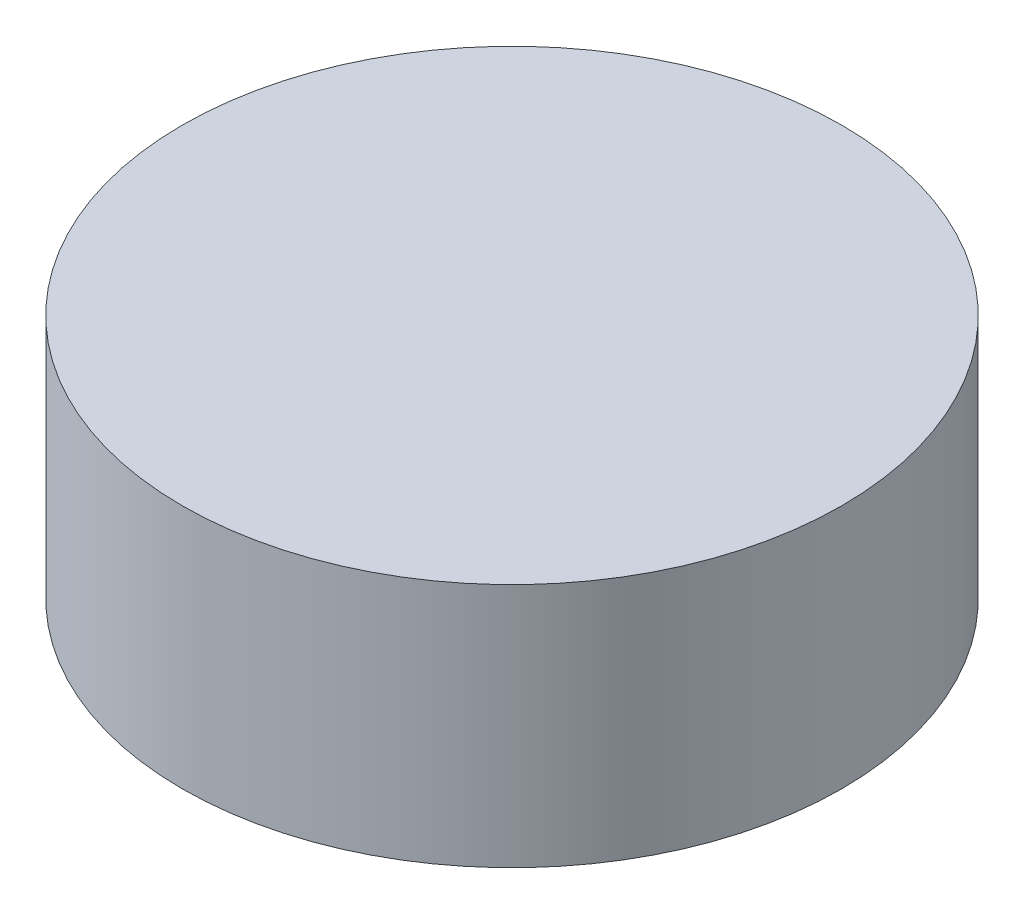
ISO-10303-21;
HEADER;
FILE_DESCRIPTION(('STEP AP214'),'2;1');
FILE_NAME('part.step','',(''),(''),'','','');
FILE_SCHEMA(('AUTOMOTIVE_DESIGN { 1 0 10303 214 1 1 1 1 }'));
ENDSEC;
DATA;
#1=APPLICATION_CONTEXT('core data for automotive mechanical design processes');
#2=APPLICATION_PROTOCOL_DEFINITION('international standard','automotive_design',2000,#1);
#3=PRODUCT_CONTEXT('',#1,'mechanical');
#4=PRODUCT('Part','Part','',(#3));
#5=PRODUCT_RELATED_PRODUCT_CATEGORY('part','',(#4));
#6=PRODUCT_DEFINITION_FORMATION('','',#4);
#7=PRODUCT_DEFINITION_CONTEXT('part definition',#1,'design');
#8=PRODUCT_DEFINITION('design','',#6,#7);
#9=PRODUCT_DEFINITION_SHAPE('','',#8);
#10=(LENGTH_UNIT() NAMED_UNIT(*) SI_UNIT(.MILLI.,.METRE.));
#11=(NAMED_UNIT(*) PLANE_ANGLE_UNIT() SI_UNIT($,.RADIAN.));
#12=(NAMED_UNIT(*) SI_UNIT($,.STERADIAN.) SOLID_ANGLE_UNIT());
#13=UNCERTAINTY_MEASURE_WITH_UNIT(LENGTH_MEASURE(1.E-05),#10,'distance_accuracy_value','');
#14=(GEOMETRIC_REPRESENTATION_CONTEXT(3) GLOBAL_UNCERTAINTY_ASSIGNED_CONTEXT((#13)) GLOBAL_UNIT_ASSIGNED_CONTEXT((#10,
#11,#12)) REPRESENTATION_CONTEXT('',''));
#15=CARTESIAN_POINT('',(0.,0.,0.));
#16=DIRECTION('',(0.,0.,1.));
#17=DIRECTION('',(1.,0.,0.));
#18=AXIS2_PLACEMENT_3D('',#15,#16,#17);
#19=CARTESIAN_POINT('',(0.,0.,0.));
#20=DIRECTION('',(0.,-1.,0.));
#21=DIRECTION('',(0.,0.,-1.));
#22=AXIS2_PLACEMENT_3D('',#19,#20,#21);
#23=CYLINDRICAL_SURFACE('',#22,2.5);
#24=DIRECTION('',(0.,1.,0.));
#25=VECTOR('',#24,1.);
#26=CARTESIAN_POINT('',(0.700000000000001,-1.40356688476183,-2.4));
#27=LINE('',#26,#25);
#28=CARTESIAN_POINT('',(0.700000000000001,0.,-2.4));
#29=VERTEX_POINT('',#28);
#30=CARTESIAN_POINT('',(0.700000000000001,2.1,-2.4));
#31=VERTEX_POINT('',#30);
#32=EDGE_CURVE('E118',#29,#31,#27,.T.);
#33=ORIENTED_EDGE('',*,*,#32,.F.);
#34=CARTESIAN_POINT('',(0.,0.,0.));
#35=DIRECTION('',(0.,-1.,0.));
#36=DIRECTION('',(0.,0.,-1.));
#37=AXIS2_PLACEMENT_3D('',#34,#35,#36);
#38=CIRCLE('',#37,2.5);
#39=CARTESIAN_POINT('',(2.4,0.,-0.7));
#40=VERTEX_POINT('',#39);
#41=EDGE_CURVE('E100',#29,#40,#38,.T.);
#42=ORIENTED_EDGE('',*,*,#41,.T.);
#43=DIRECTION('',(0.,1.,0.));
#44=VECTOR('',#43,1.);
#45=CARTESIAN_POINT('',(2.4,-1.40356688476183,-0.7));
#46=LINE('',#45,#44);
#47=CARTESIAN_POINT('',(2.4,2.1,-0.700000000000001));
#48=VERTEX_POINT('',#47);
#49=EDGE_CURVE('E130',#40,#48,#46,.T.);
#50=ORIENTED_EDGE('',*,*,#49,.T.);
#51=CARTESIAN_POINT('',(0.,2.1,0.));
#52=DIRECTION('',(0.,-1.,0.));
#53=DIRECTION('',(0.,0.,-1.));
#54=AXIS2_PLACEMENT_3D('',#51,#52,#53);
#55=CIRCLE('',#54,2.5);
#56=EDGE_CURVE('E119',#31,#48,#55,.T.);
#57=ORIENTED_EDGE('',*,*,#56,.F.);
#58=EDGE_LOOP('',(#33,#42,#50,#57));
#59=FACE_BOUND('',#58,.T.);
#60=ADVANCED_FACE('F34',(#59),#23,.F.);
#61=DIRECTION('',(0.,1.,0.));
#62=VECTOR('',#61,1.);
#63=CARTESIAN_POINT('',(-0.700000000000001,-1.40356688476183,-2.4));
#64=LINE('',#63,#62);
#65=CARTESIAN_POINT('',(-0.700000000000001,0.,-2.4));
#66=VERTEX_POINT('',#65);
#67=CARTESIAN_POINT('',(-0.700000000000001,2.1,-2.4));
#68=VERTEX_POINT('',#67);
#69=EDGE_CURVE('E57',#66,#68,#64,.T.);
#70=ORIENTED_EDGE('',*,*,#69,.T.);
#71=CARTESIAN_POINT('',(-2.4,2.1,-0.700000000000003));
#72=VERTEX_POINT('',#71);
#73=EDGE_CURVE('E159',#72,#68,#55,.T.);
#74=ORIENTED_EDGE('',*,*,#73,.F.);
#75=DIRECTION('',(0.,1.,0.));
#76=VECTOR('',#75,1.);
#77=CARTESIAN_POINT('',(-2.4,-1.40356688476183,-0.700000000000003));
#78=LINE('',#77,#76);
#79=CARTESIAN_POINT('',(-2.4,0.,-0.700000000000003));
#80=VERTEX_POINT('',#79);
#81=EDGE_CURVE('E140',#80,#72,#78,.T.);
#82=ORIENTED_EDGE('',*,*,#81,.F.);
#83=EDGE_CURVE('E113',#80,#66,#38,.T.);
#84=ORIENTED_EDGE('',*,*,#83,.T.);
#85=EDGE_LOOP('',(#70,#74,#82,#84));
#86=FACE_BOUND('',#85,.T.);
#87=ADVANCED_FACE('F184',(#86),#23,.F.);
#88=CARTESIAN_POINT('',(-2.5,2.1,0.));
#89=DIRECTION('',(0.,1.,0.));
#90=DIRECTION('',(0.,0.,1.));
#91=AXIS2_PLACEMENT_3D('',#88,#89,#90);
#92=PLANE('',#91);
#93=DIRECTION('',(-1.,0.,0.));
#94=VECTOR('',#93,1.);
#95=CARTESIAN_POINT('',(0.,2.1,-2.4));
#96=LINE('',#95,#94);
#97=EDGE_CURVE('E49',#31,#68,#96,.T.);
#98=ORIENTED_EDGE('',*,*,#97,.F.);
#99=ORIENTED_EDGE('',*,*,#56,.T.);
#100=DIRECTION('',(0.,0.,1.));
#101=VECTOR('',#100,1.);
#102=CARTESIAN_POINT('',(2.4,2.1,0.));
#103=LINE('',#102,#101);
#104=CARTESIAN_POINT('',(2.4,2.1,0.700000000000001));
#105=VERTEX_POINT('',#104);
#106=EDGE_CURVE('E123',#48,#105,#103,.T.);
#107=ORIENTED_EDGE('',*,*,#106,.T.);
#108=CARTESIAN_POINT('',(0.700000000000001,2.1,2.4));
#109=VERTEX_POINT('',#108);
#110=EDGE_CURVE('E150',#105,#109,#55,.T.);
#111=ORIENTED_EDGE('',*,*,#110,.T.);
#112=DIRECTION('',(-1.,0.,0.));
#113=VECTOR('',#112,1.);
#114=CARTESIAN_POINT('',(0.,2.1,2.4));
#115=LINE('',#114,#113);
#116=CARTESIAN_POINT('',(-0.700000000000001,2.1,2.4));
#117=VERTEX_POINT('',#116);
#118=EDGE_CURVE('E146',#109,#117,#115,.T.);
#119=ORIENTED_EDGE('',*,*,#118,.T.);
#120=CARTESIAN_POINT('',(-2.4,2.1,0.700000000000003));
#121=VERTEX_POINT('',#120);
#122=EDGE_CURVE('E158',#117,#121,#55,.T.);
#123=ORIENTED_EDGE('',*,*,#122,.T.);
#124=DIRECTION('',(0.,0.,1.));
#125=VECTOR('',#124,1.);
#126=CARTESIAN_POINT('',(-2.4,2.1,0.));
#127=LINE('',#126,#125);
#128=EDGE_CURVE('E129',#72,#121,#127,.T.);
#129=ORIENTED_EDGE('',*,*,#128,.F.);
#130=ORIENTED_EDGE('',*,*,#73,.T.);
#131=EDGE_LOOP('',(#98,#99,#107,#111,#119,#123,#129,#130));
#132=FACE_BOUND('',#131,.T.);
#133=ADVANCED_FACE('F189',(#132),#92,.F.);
#134=ORIENTED_EDGE('',*,*,#110,.F.);
#135=DIRECTION('',(0.,1.,0.));
#136=VECTOR('',#135,1.);
#137=CARTESIAN_POINT('',(2.4,-1.40356688476183,0.7));
#138=LINE('',#137,#136);
#139=CARTESIAN_POINT('',(2.4,0.,0.7));
#140=VERTEX_POINT('',#139);
#141=EDGE_CURVE('E125',#140,#105,#138,.T.);
#142=ORIENTED_EDGE('',*,*,#141,.F.);
#143=CARTESIAN_POINT('',(0.700000000000001,0.,2.4));
#144=VERTEX_POINT('',#143);
#145=EDGE_CURVE('E114',#140,#144,#38,.T.);
#146=ORIENTED_EDGE('',*,*,#145,.T.);
#147=DIRECTION('',(0.,1.,0.));
#148=VECTOR('',#147,1.);
#149=CARTESIAN_POINT('',(0.700000000000001,-1.40356688476183,2.4));
#150=LINE('',#149,#148);
#151=EDGE_CURVE('E151',#144,#109,#150,.T.);
#152=ORIENTED_EDGE('',*,*,#151,.T.);
#153=EDGE_LOOP('',(#134,#142,#146,#152));
#154=FACE_BOUND('',#153,.T.);
#155=ADVANCED_FACE('F181',(#154),#23,.F.);
#156=DIRECTION('',(0.,1.,0.));
#157=VECTOR('',#156,1.);
#158=CARTESIAN_POINT('',(-2.4,-1.40356688476183,0.700000000000003));
#159=LINE('',#158,#157);
#160=CARTESIAN_POINT('',(-2.4,0.,0.700000000000003));
#161=VERTEX_POINT('',#160);
#162=EDGE_CURVE('E137',#161,#121,#159,.T.);
#163=ORIENTED_EDGE('',*,*,#162,.T.);
#164=ORIENTED_EDGE('',*,*,#122,.F.);
#165=DIRECTION('',(0.,1.,0.));
#166=VECTOR('',#165,1.);
#167=CARTESIAN_POINT('',(-0.700000000000001,-1.40356688476183,2.4));
#168=LINE('',#167,#166);
#169=CARTESIAN_POINT('',(-0.700000000000001,0.,2.4));
#170=VERTEX_POINT('',#169);
#171=EDGE_CURVE('E154',#170,#117,#168,.T.);
#172=ORIENTED_EDGE('',*,*,#171,.F.);
#173=EDGE_CURVE('E116',#170,#161,#38,.T.);
#174=ORIENTED_EDGE('',*,*,#173,.T.);
#175=EDGE_LOOP('',(#163,#164,#172,#174));
#176=FACE_BOUND('',#175,.T.);
#177=ADVANCED_FACE('F177',(#176),#23,.F.);
#178=CARTESIAN_POINT('',(0.,3.1,0.));
#179=DIRECTION('',(0.,-1.,0.));
#180=DIRECTION('',(0.,0.,-1.));
#181=AXIS2_PLACEMENT_3D('',#178,#179,#180);
#182=PLANE('',#181);
#183=CARTESIAN_POINT('',(0.,3.1,0.));
#184=DIRECTION('',(0.,-1.,0.));
#185=DIRECTION('',(0.,0.,-1.));
#186=AXIS2_PLACEMENT_3D('',#183,#184,#185);
#187=CIRCLE('',#186,3.9);
#188=CARTESIAN_POINT('',(0.,3.1,-3.9));
#189=VERTEX_POINT('',#188);
#190=EDGE_CURVE('E11',#189,#189,#187,.T.);
#191=ORIENTED_EDGE('',*,*,#190,.F.);
#192=EDGE_LOOP('',(#191));
#193=FACE_BOUND('',#192,.T.);
#194=ADVANCED_FACE('F36',(#193),#182,.F.);
#195=CARTESIAN_POINT('',(0.,0.,0.));
#196=DIRECTION('',(0.,-1.,0.));
#197=DIRECTION('',(0.,0.,-1.));
#198=AXIS2_PLACEMENT_3D('',#195,#196,#197);
#199=CYLINDRICAL_SURFACE('',#198,3.9);
#200=CARTESIAN_POINT('',(0.,0.2,0.));
#201=DIRECTION('',(0.,-1.,0.));
#202=DIRECTION('',(0.,0.,-1.));
#203=AXIS2_PLACEMENT_3D('',#200,#201,#202);
#204=CIRCLE('',#203,3.9);
#205=CARTESIAN_POINT('',(0.,0.2,-3.9));
#206=VERTEX_POINT('',#205);
#207=EDGE_CURVE('E42',#206,#206,#204,.T.);
#208=ORIENTED_EDGE('',*,*,#207,.F.);
#209=EDGE_LOOP('',(#208));
#210=FACE_BOUND('',#209,.T.);
#211=ORIENTED_EDGE('',*,*,#190,.T.);
#212=EDGE_LOOP('',(#211));
#213=FACE_BOUND('',#212,.T.);
#214=ADVANCED_FACE('F171',(#210,#213),#199,.T.);
#215=CARTESIAN_POINT('',(-3.9,0.2,0.));
#216=DIRECTION('',(0.,1.,0.));
#217=DIRECTION('',(0.,0.,1.));
#218=AXIS2_PLACEMENT_3D('',#215,#216,#217);
#219=PLANE('',#218);
#220=CARTESIAN_POINT('',(0.,0.200000000000001,0.));
#221=DIRECTION('',(0.,-1.,0.));
#222=DIRECTION('',(0.,0.,-1.));
#223=AXIS2_PLACEMENT_3D('',#220,#221,#222);
#224=CIRCLE('',#223,3.);
#225=CARTESIAN_POINT('',(0.,0.200000000000001,-3.));
#226=VERTEX_POINT('',#225);
#227=EDGE_CURVE('E164',#226,#226,#224,.T.);
#228=ORIENTED_EDGE('',*,*,#227,.F.);
#229=EDGE_LOOP('',(#228));
#230=FACE_BOUND('',#229,.T.);
#231=ORIENTED_EDGE('',*,*,#207,.T.);
#232=EDGE_LOOP('',(#231));
#233=FACE_BOUND('',#232,.T.);
#234=ADVANCED_FACE('F169',(#230,#233),#219,.F.);
#235=CARTESIAN_POINT('',(0.,0.,0.));
#236=DIRECTION('',(0.,-1.,0.));
#237=DIRECTION('',(0.,0.,-1.));
#238=AXIS2_PLACEMENT_3D('',#235,#236,#237);
#239=CYLINDRICAL_SURFACE('',#238,3.);
#240=CARTESIAN_POINT('',(0.,0.,0.));
#241=DIRECTION('',(0.,-1.,0.));
#242=DIRECTION('',(0.,0.,-1.));
#243=AXIS2_PLACEMENT_3D('',#240,#241,#242);
#244=CIRCLE('',#243,3.);
#245=CARTESIAN_POINT('',(0.,0.,-3.));
#246=VERTEX_POINT('',#245);
#247=EDGE_CURVE('E161',#246,#246,#244,.T.);
#248=ORIENTED_EDGE('',*,*,#247,.F.);
#249=EDGE_LOOP('',(#248));
#250=FACE_BOUND('',#249,.T.);
#251=ORIENTED_EDGE('',*,*,#227,.T.);
#252=EDGE_LOOP('',(#251));
#253=FACE_BOUND('',#252,.T.);
#254=ADVANCED_FACE('F220',(#250,#253),#239,.T.);
#255=CARTESIAN_POINT('',(-3.,0.,0.));
#256=DIRECTION('',(0.,1.,0.));
#257=DIRECTION('',(0.,0.,1.));
#258=AXIS2_PLACEMENT_3D('',#255,#256,#257);
#259=PLANE('',#258);
#260=ORIENTED_EDGE('',*,*,#173,.F.);
#261=DIRECTION('',(1.,0.,0.));
#262=VECTOR('',#261,1.);
#263=CARTESIAN_POINT('',(0.,0.,2.4));
#264=LINE('',#263,#262);
#265=EDGE_CURVE('E147',#170,#144,#264,.T.);
#266=ORIENTED_EDGE('',*,*,#265,.T.);
#267=ORIENTED_EDGE('',*,*,#145,.F.);
#268=DIRECTION('',(0.,0.,-1.));
#269=VECTOR('',#268,1.);
#270=CARTESIAN_POINT('',(2.4,0.,0.));
#271=LINE('',#270,#269);
#272=EDGE_CURVE('E109',#140,#40,#271,.T.);
#273=ORIENTED_EDGE('',*,*,#272,.T.);
#274=ORIENTED_EDGE('',*,*,#41,.F.);
#275=DIRECTION('',(1.,0.,0.));
#276=VECTOR('',#275,1.);
#277=CARTESIAN_POINT('',(0.,0.,-2.4));
#278=LINE('',#277,#276);
#279=EDGE_CURVE('E107',#66,#29,#278,.T.);
#280=ORIENTED_EDGE('',*,*,#279,.F.);
#281=ORIENTED_EDGE('',*,*,#83,.F.);
#282=DIRECTION('',(0.,0.,-1.));
#283=VECTOR('',#282,1.);
#284=CARTESIAN_POINT('',(-2.4,0.,0.));
#285=LINE('',#284,#283);
#286=EDGE_CURVE('E143',#161,#80,#285,.T.);
#287=ORIENTED_EDGE('',*,*,#286,.F.);
#288=EDGE_LOOP('',(#260,#266,#267,#273,#274,#280,#281,#287));
#289=FACE_BOUND('',#288,.T.);
#290=ORIENTED_EDGE('',*,*,#247,.T.);
#291=EDGE_LOOP('',(#290));
#292=FACE_BOUND('',#291,.T.);
#293=ADVANCED_FACE('F103',(#289,#292),#259,.F.);
#294=CARTESIAN_POINT('',(0.,-1.40356688476183,2.4));
#295=DIRECTION('',(0.,0.,-1.));
#296=DIRECTION('',(-1.,0.,0.));
#297=AXIS2_PLACEMENT_3D('',#294,#295,#296);
#298=PLANE('',#297);
#299=ORIENTED_EDGE('',*,*,#265,.F.);
#300=ORIENTED_EDGE('',*,*,#171,.T.);
#301=ORIENTED_EDGE('',*,*,#118,.F.);
#302=ORIENTED_EDGE('',*,*,#151,.F.);
#303=EDGE_LOOP('',(#299,#300,#301,#302));
#304=FACE_BOUND('',#303,.T.);
#305=ADVANCED_FACE('F211',(#304),#298,.T.);
#306=CARTESIAN_POINT('',(-2.4,-1.40356688476183,0.));
#307=DIRECTION('',(-1.,0.,0.));
#308=DIRECTION('',(0.,0.,1.));
#309=AXIS2_PLACEMENT_3D('',#306,#307,#308);
#310=PLANE('',#309);
#311=ORIENTED_EDGE('',*,*,#162,.F.);
#312=ORIENTED_EDGE('',*,*,#286,.T.);
#313=ORIENTED_EDGE('',*,*,#81,.T.);
#314=ORIENTED_EDGE('',*,*,#128,.T.);
#315=EDGE_LOOP('',(#311,#312,#313,#314));
#316=FACE_BOUND('',#315,.T.);
#317=ADVANCED_FACE('F207',(#316),#310,.F.);
#318=CARTESIAN_POINT('',(2.4,-1.40356688476183,0.));
#319=DIRECTION('',(-1.,0.,0.));
#320=DIRECTION('',(0.,0.,1.));
#321=AXIS2_PLACEMENT_3D('',#318,#319,#320);
#322=PLANE('',#321);
#323=ORIENTED_EDGE('',*,*,#272,.F.);
#324=ORIENTED_EDGE('',*,*,#141,.T.);
#325=ORIENTED_EDGE('',*,*,#106,.F.);
#326=ORIENTED_EDGE('',*,*,#49,.F.);
#327=EDGE_LOOP('',(#323,#324,#325,#326));
#328=FACE_BOUND('',#327,.T.);
#329=ADVANCED_FACE('F203',(#328),#322,.T.);
#330=CARTESIAN_POINT('',(0.,-1.40356688476183,-2.4));
#331=DIRECTION('',(0.,0.,-1.));
#332=DIRECTION('',(-1.,0.,0.));
#333=AXIS2_PLACEMENT_3D('',#330,#331,#332);
#334=PLANE('',#333);
#335=ORIENTED_EDGE('',*,*,#69,.F.);
#336=ORIENTED_EDGE('',*,*,#279,.T.);
#337=ORIENTED_EDGE('',*,*,#32,.T.);
#338=ORIENTED_EDGE('',*,*,#97,.T.);
#339=EDGE_LOOP('',(#335,#336,#337,#338));
#340=FACE_BOUND('',#339,.T.);
#341=ADVANCED_FACE('F122',(#340),#334,.F.);
#342=CLOSED_SHELL('',(#60,#87,#133,#155,#177,#194,#214,#234,#254,#293,#305,#317,#329,#341));
#343=MANIFOLD_SOLID_BREP('B2',#342);
#344=ADVANCED_BREP_SHAPE_REPRESENTATION('',(#18,#343),#14);
#345=SHAPE_DEFINITION_REPRESENTATION(#9,#344);
ENDSEC;
END-ISO-10303-21;
